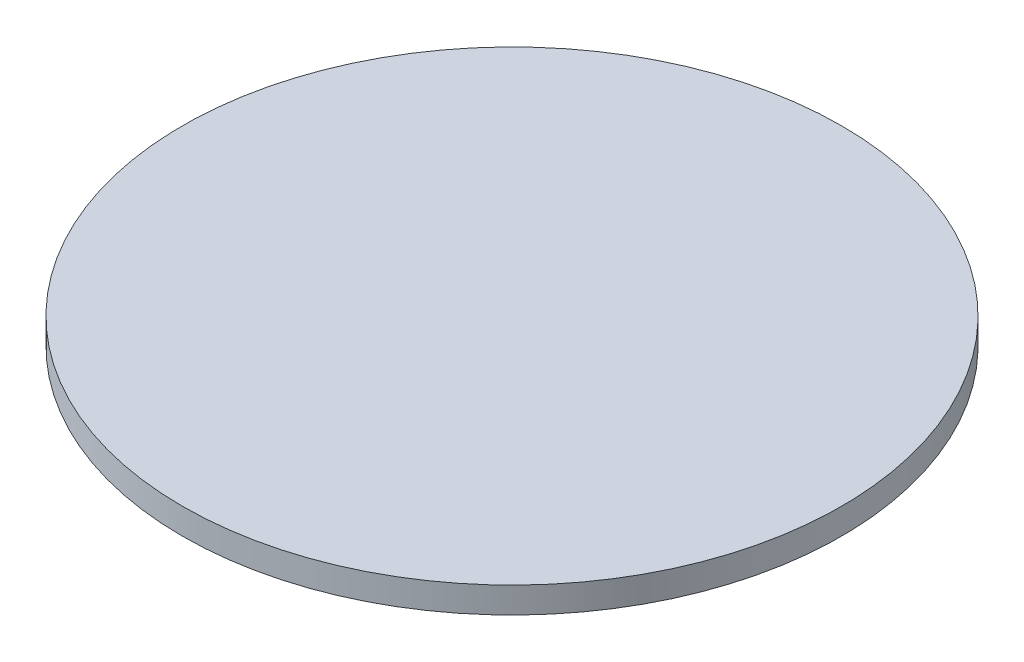
ISO-10303-21;
HEADER;
FILE_DESCRIPTION(('STEP AP214'),'2;1');
FILE_NAME('part.step','',(''),(''),'','','');
FILE_SCHEMA(('AUTOMOTIVE_DESIGN { 1 0 10303 214 1 1 1 1 }'));
ENDSEC;
DATA;
#1=APPLICATION_CONTEXT('core data for automotive mechanical design processes');
#2=APPLICATION_PROTOCOL_DEFINITION('international standard','automotive_design',2000,#1);
#3=PRODUCT_CONTEXT('',#1,'mechanical');
#4=PRODUCT('Part','Part','',(#3));
#5=PRODUCT_RELATED_PRODUCT_CATEGORY('part','',(#4));
#6=PRODUCT_DEFINITION_FORMATION('','',#4);
#7=PRODUCT_DEFINITION_CONTEXT('part definition',#1,'design');
#8=PRODUCT_DEFINITION('design','',#6,#7);
#9=PRODUCT_DEFINITION_SHAPE('','',#8);
#10=(LENGTH_UNIT() NAMED_UNIT(*) SI_UNIT(.MILLI.,.METRE.));
#11=(NAMED_UNIT(*) PLANE_ANGLE_UNIT() SI_UNIT($,.RADIAN.));
#12=(NAMED_UNIT(*) SI_UNIT($,.STERADIAN.) SOLID_ANGLE_UNIT());
#13=UNCERTAINTY_MEASURE_WITH_UNIT(LENGTH_MEASURE(1.E-05),#10,'distance_accuracy_value','');
#14=(GEOMETRIC_REPRESENTATION_CONTEXT(3) GLOBAL_UNCERTAINTY_ASSIGNED_CONTEXT((#13)) GLOBAL_UNIT_ASSIGNED_CONTEXT((#10,
#11,#12)) REPRESENTATION_CONTEXT('',''));
#15=CARTESIAN_POINT('',(0.,0.,0.));
#16=DIRECTION('',(0.,0.,1.));
#17=DIRECTION('',(1.,0.,0.));
#18=AXIS2_PLACEMENT_3D('',#15,#16,#17);
#19=CARTESIAN_POINT('',(25.4,0.,0.));
#20=DIRECTION('',(0.,-1.,0.));
#21=DIRECTION('',(0.,0.,-1.));
#22=AXIS2_PLACEMENT_3D('',#19,#20,#21);
#23=PLANE('',#22);
#24=CARTESIAN_POINT('',(0.,0.,0.));
#25=DIRECTION('',(0.,-1.,0.));
#26=DIRECTION('',(0.,0.,-1.));
#27=AXIS2_PLACEMENT_3D('',#24,#25,#26);
#28=CIRCLE('',#27,25.4);
#29=CARTESIAN_POINT('',(0.,0.,-25.4));
#30=VERTEX_POINT('',#29);
#31=EDGE_CURVE('E37',#30,#30,#28,.T.);
#32=ORIENTED_EDGE('',*,*,#31,.T.);
#33=EDGE_LOOP('',(#32));
#34=FACE_BOUND('',#33,.T.);
#35=ADVANCED_FACE('F31',(#34),#23,.T.);
#36=CARTESIAN_POINT('',(0.,2.,0.));
#37=DIRECTION('',(0.,1.,0.));
#38=DIRECTION('',(0.,0.,1.));
#39=AXIS2_PLACEMENT_3D('',#36,#37,#38);
#40=PLANE('',#39);
#41=CARTESIAN_POINT('',(0.,2.,0.));
#42=DIRECTION('',(0.,-1.,0.));
#43=DIRECTION('',(0.,0.,-1.));
#44=AXIS2_PLACEMENT_3D('',#41,#42,#43);
#45=CIRCLE('',#44,25.4);
#46=CARTESIAN_POINT('',(0.,2.,-25.4));
#47=VERTEX_POINT('',#46);
#48=EDGE_CURVE('E10',#47,#47,#45,.T.);
#49=ORIENTED_EDGE('',*,*,#48,.F.);
#50=EDGE_LOOP('',(#49));
#51=FACE_BOUND('',#50,.T.);
#52=ADVANCED_FACE('F46',(#51),#40,.T.);
#53=CARTESIAN_POINT('',(0.,-500.,0.));
#54=DIRECTION('',(0.,-1.,0.));
#55=DIRECTION('',(0.,0.,-1.));
#56=AXIS2_PLACEMENT_3D('',#53,#54,#55);
#57=CYLINDRICAL_SURFACE('',#56,25.4);
#58=ORIENTED_EDGE('',*,*,#48,.T.);
#59=EDGE_LOOP('',(#58));
#60=FACE_BOUND('',#59,.T.);
#61=ORIENTED_EDGE('',*,*,#31,.F.);
#62=EDGE_LOOP('',(#61));
#63=FACE_BOUND('',#62,.T.);
#64=ADVANCED_FACE('F44',(#60,#63),#57,.T.);
#65=CLOSED_SHELL('',(#35,#52,#64));
#66=MANIFOLD_SOLID_BREP('B2',#65);
#67=ADVANCED_BREP_SHAPE_REPRESENTATION('',(#18,#66),#14);
#68=SHAPE_DEFINITION_REPRESENTATION(#9,#67);
ENDSEC;
END-ISO-10303-21;
